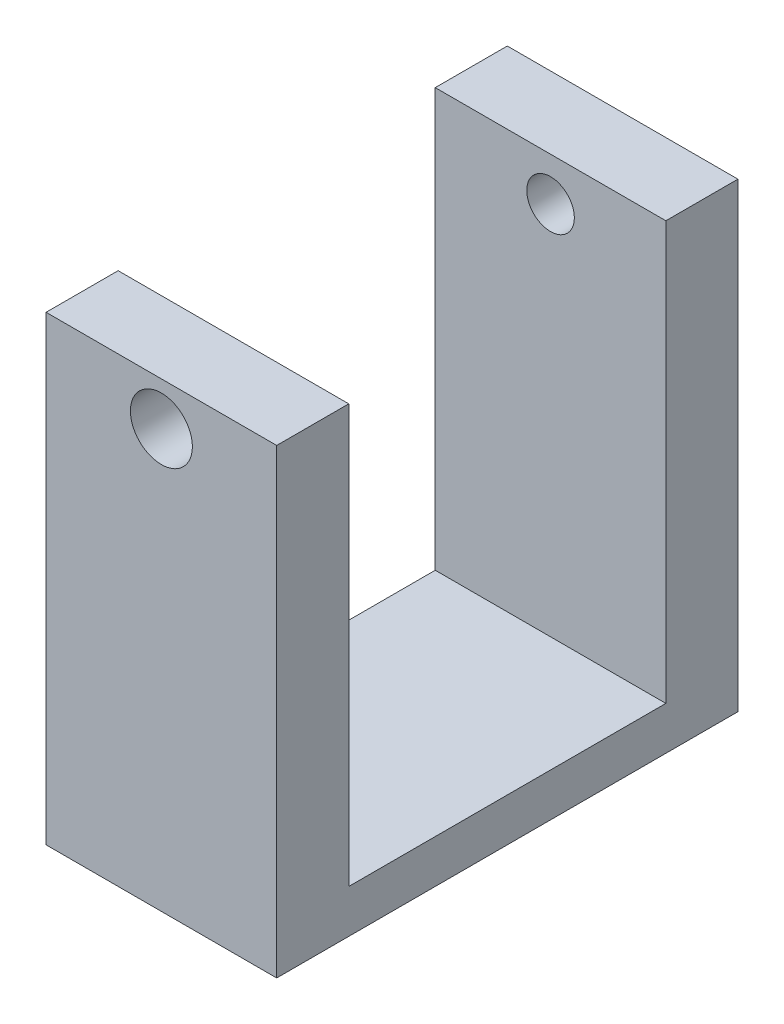
ISO-10303-21;
HEADER;
FILE_DESCRIPTION(('STEP AP214'),'2;1');
FILE_NAME('part.step','',(''),(''),'','','');
FILE_SCHEMA(('AUTOMOTIVE_DESIGN { 1 0 10303 214 1 1 1 1 }'));
ENDSEC;
DATA;
#1=APPLICATION_CONTEXT('core data for automotive mechanical design processes');
#2=APPLICATION_PROTOCOL_DEFINITION('international standard','automotive_design',2000,#1);
#3=PRODUCT_CONTEXT('',#1,'mechanical');
#4=PRODUCT('Part','Part','',(#3));
#5=PRODUCT_RELATED_PRODUCT_CATEGORY('part','',(#4));
#6=PRODUCT_DEFINITION_FORMATION('','',#4);
#7=PRODUCT_DEFINITION_CONTEXT('part definition',#1,'design');
#8=PRODUCT_DEFINITION('design','',#6,#7);
#9=PRODUCT_DEFINITION_SHAPE('','',#8);
#10=(LENGTH_UNIT() NAMED_UNIT(*) SI_UNIT(.MILLI.,.METRE.));
#11=(NAMED_UNIT(*) PLANE_ANGLE_UNIT() SI_UNIT($,.RADIAN.));
#12=(NAMED_UNIT(*) SI_UNIT($,.STERADIAN.) SOLID_ANGLE_UNIT());
#13=UNCERTAINTY_MEASURE_WITH_UNIT(LENGTH_MEASURE(1.E-05),#10,'distance_accuracy_value','');
#14=(GEOMETRIC_REPRESENTATION_CONTEXT(3) GLOBAL_UNCERTAINTY_ASSIGNED_CONTEXT((#13)) GLOBAL_UNIT_ASSIGNED_CONTEXT((#10,
#11,#12)) REPRESENTATION_CONTEXT('',''));
#15=CARTESIAN_POINT('',(0.,0.,0.));
#16=DIRECTION('',(0.,0.,1.));
#17=DIRECTION('',(1.,0.,0.));
#18=AXIS2_PLACEMENT_3D('',#15,#16,#17);
#19=CARTESIAN_POINT('',(8.,32.,16.));
#20=DIRECTION('',(0.,-1.,0.));
#21=DIRECTION('',(0.,0.,-1.));
#22=AXIS2_PLACEMENT_3D('',#19,#20,#21);
#23=PLANE('',#22);
#24=DIRECTION('',(0.,0.,1.));
#25=VECTOR('',#24,1.);
#26=CARTESIAN_POINT('',(-8.,32.,16.));
#27=LINE('',#26,#25);
#28=CARTESIAN_POINT('',(-8.,32.,11.));
#29=VERTEX_POINT('',#28);
#30=CARTESIAN_POINT('',(-8.,32.,16.));
#31=VERTEX_POINT('',#30);
#32=EDGE_CURVE('E219',#29,#31,#27,.T.);
#33=ORIENTED_EDGE('',*,*,#32,.T.);
#34=DIRECTION('',(-1.,0.,0.));
#35=VECTOR('',#34,1.);
#36=CARTESIAN_POINT('',(8.,32.,16.));
#37=LINE('',#36,#35);
#38=CARTESIAN_POINT('',(8.,32.,16.));
#39=VERTEX_POINT('',#38);
#40=EDGE_CURVE('E14',#39,#31,#37,.T.);
#41=ORIENTED_EDGE('',*,*,#40,.F.);
#42=DIRECTION('',(0.,0.,1.));
#43=VECTOR('',#42,1.);
#44=CARTESIAN_POINT('',(8.,32.,16.));
#45=LINE('',#44,#43);
#46=CARTESIAN_POINT('',(8.,32.,11.));
#47=VERTEX_POINT('',#46);
#48=EDGE_CURVE('E240',#47,#39,#45,.T.);
#49=ORIENTED_EDGE('',*,*,#48,.F.);
#50=DIRECTION('',(-1.,0.,0.));
#51=VECTOR('',#50,1.);
#52=CARTESIAN_POINT('',(8.,32.,11.));
#53=LINE('',#52,#51);
#54=EDGE_CURVE('E215',#47,#29,#53,.T.);
#55=ORIENTED_EDGE('',*,*,#54,.T.);
#56=EDGE_LOOP('',(#33,#41,#49,#55));
#57=FACE_BOUND('',#56,.T.);
#58=ADVANCED_FACE('F105',(#57),#23,.F.);
#59=CARTESIAN_POINT('',(8.,32.,16.));
#60=DIRECTION('',(0.,0.,-1.));
#61=DIRECTION('',(0.,1.,0.));
#62=AXIS2_PLACEMENT_3D('',#59,#60,#61);
#63=PLANE('',#62);
#64=CARTESIAN_POINT('',(0.,29.,16.));
#65=DIRECTION('',(0.,0.,1.));
#66=DIRECTION('',(1.,0.,0.));
#67=AXIS2_PLACEMENT_3D('',#64,#65,#66);
#68=CIRCLE('',#67,2.14999999999999);
#69=CARTESIAN_POINT('',(2.14999999999999,29.,16.));
#70=VERTEX_POINT('',#69);
#71=EDGE_CURVE('E283',#70,#70,#68,.T.);
#72=ORIENTED_EDGE('',*,*,#71,.F.);
#73=EDGE_LOOP('',(#72));
#74=FACE_BOUND('',#73,.T.);
#75=DIRECTION('',(0.,-1.,0.));
#76=VECTOR('',#75,1.);
#77=CARTESIAN_POINT('',(-8.,32.,16.));
#78=LINE('',#77,#76);
#79=CARTESIAN_POINT('',(-8.,0.,16.));
#80=VERTEX_POINT('',#79);
#81=EDGE_CURVE('E223',#31,#80,#78,.T.);
#82=ORIENTED_EDGE('',*,*,#81,.T.);
#83=DIRECTION('',(-1.,0.,0.));
#84=VECTOR('',#83,1.);
#85=CARTESIAN_POINT('',(8.,0.,16.));
#86=LINE('',#85,#84);
#87=CARTESIAN_POINT('',(8.,0.,16.));
#88=VERTEX_POINT('',#87);
#89=EDGE_CURVE('E114',#88,#80,#86,.T.);
#90=ORIENTED_EDGE('',*,*,#89,.F.);
#91=DIRECTION('',(0.,-1.,0.));
#92=VECTOR('',#91,1.);
#93=CARTESIAN_POINT('',(8.,32.,16.));
#94=LINE('',#93,#92);
#95=EDGE_CURVE('E174',#39,#88,#94,.T.);
#96=ORIENTED_EDGE('',*,*,#95,.F.);
#97=ORIENTED_EDGE('',*,*,#40,.T.);
#98=EDGE_LOOP('',(#82,#90,#96,#97));
#99=FACE_BOUND('',#98,.T.);
#100=ADVANCED_FACE('F311',(#74,#99),#63,.F.);
#101=CARTESIAN_POINT('',(8.,0.,16.));
#102=DIRECTION('',(0.,1.,0.));
#103=DIRECTION('',(0.,0.,1.));
#104=AXIS2_PLACEMENT_3D('',#101,#102,#103);
#105=PLANE('',#104);
#106=CARTESIAN_POINT('',(0.,0.,-13.5));
#107=DIRECTION('',(0.,-1.,0.));
#108=DIRECTION('',(0.,0.,-1.));
#109=AXIS2_PLACEMENT_3D('',#106,#107,#108);
#110=CIRCLE('',#109,1.25);
#111=CARTESIAN_POINT('',(0.,0.,-14.75));
#112=VERTEX_POINT('',#111);
#113=EDGE_CURVE('E303',#112,#112,#110,.T.);
#114=ORIENTED_EDGE('',*,*,#113,.F.);
#115=EDGE_LOOP('',(#114));
#116=FACE_BOUND('',#115,.T.);
#117=CARTESIAN_POINT('',(0.,0.,13.5));
#118=DIRECTION('',(0.,-1.,0.));
#119=DIRECTION('',(0.,0.,-1.));
#120=AXIS2_PLACEMENT_3D('',#117,#118,#119);
#121=CIRCLE('',#120,1.25);
#122=CARTESIAN_POINT('',(0.,0.,12.25));
#123=VERTEX_POINT('',#122);
#124=EDGE_CURVE('E297',#123,#123,#121,.T.);
#125=ORIENTED_EDGE('',*,*,#124,.F.);
#126=EDGE_LOOP('',(#125));
#127=FACE_BOUND('',#126,.T.);
#128=DIRECTION('',(0.,0.,-1.));
#129=VECTOR('',#128,1.);
#130=CARTESIAN_POINT('',(-8.,0.,16.));
#131=LINE('',#130,#129);
#132=CARTESIAN_POINT('',(-8.,0.,-16.));
#133=VERTEX_POINT('',#132);
#134=EDGE_CURVE('E227',#80,#133,#131,.T.);
#135=ORIENTED_EDGE('',*,*,#134,.T.);
#136=DIRECTION('',(-1.,0.,0.));
#137=VECTOR('',#136,1.);
#138=CARTESIAN_POINT('',(8.,0.,-16.));
#139=LINE('',#138,#137);
#140=CARTESIAN_POINT('',(8.,0.,-16.));
#141=VERTEX_POINT('',#140);
#142=EDGE_CURVE('E249',#141,#133,#139,.T.);
#143=ORIENTED_EDGE('',*,*,#142,.F.);
#144=DIRECTION('',(0.,0.,-1.));
#145=VECTOR('',#144,1.);
#146=CARTESIAN_POINT('',(8.,0.,16.));
#147=LINE('',#146,#145);
#148=EDGE_CURVE('E260',#88,#141,#147,.T.);
#149=ORIENTED_EDGE('',*,*,#148,.F.);
#150=ORIENTED_EDGE('',*,*,#89,.T.);
#151=EDGE_LOOP('',(#135,#143,#149,#150));
#152=FACE_BOUND('',#151,.T.);
#153=ADVANCED_FACE('F258',(#116,#127,#152),#105,.F.);
#154=CARTESIAN_POINT('',(8.,32.,-16.));
#155=DIRECTION('',(0.,0.,1.));
#156=DIRECTION('',(0.,-1.,0.));
#157=AXIS2_PLACEMENT_3D('',#154,#155,#156);
#158=PLANE('',#157);
#159=CARTESIAN_POINT('',(0.,29.,-16.));
#160=DIRECTION('',(0.,0.,-1.));
#161=DIRECTION('',(0.,1.,0.));
#162=AXIS2_PLACEMENT_3D('',#159,#160,#161);
#163=CIRCLE('',#162,1.64999999999999);
#164=CARTESIAN_POINT('',(0.,30.65,-16.));
#165=VERTEX_POINT('',#164);
#166=EDGE_CURVE('E291',#165,#165,#163,.T.);
#167=ORIENTED_EDGE('',*,*,#166,.F.);
#168=EDGE_LOOP('',(#167));
#169=FACE_BOUND('',#168,.T.);
#170=DIRECTION('',(0.,1.,0.));
#171=VECTOR('',#170,1.);
#172=CARTESIAN_POINT('',(-8.,32.,-16.));
#173=LINE('',#172,#171);
#174=CARTESIAN_POINT('',(-8.,32.,-16.));
#175=VERTEX_POINT('',#174);
#176=EDGE_CURVE('E229',#133,#175,#173,.T.);
#177=ORIENTED_EDGE('',*,*,#176,.T.);
#178=DIRECTION('',(-1.,0.,0.));
#179=VECTOR('',#178,1.);
#180=CARTESIAN_POINT('',(8.,32.,-16.));
#181=LINE('',#180,#179);
#182=CARTESIAN_POINT('',(8.,32.,-16.));
#183=VERTEX_POINT('',#182);
#184=EDGE_CURVE('E246',#183,#175,#181,.T.);
#185=ORIENTED_EDGE('',*,*,#184,.F.);
#186=DIRECTION('',(0.,1.,0.));
#187=VECTOR('',#186,1.);
#188=CARTESIAN_POINT('',(8.,32.,-16.));
#189=LINE('',#188,#187);
#190=EDGE_CURVE('E272',#141,#183,#189,.T.);
#191=ORIENTED_EDGE('',*,*,#190,.F.);
#192=ORIENTED_EDGE('',*,*,#142,.T.);
#193=EDGE_LOOP('',(#177,#185,#191,#192));
#194=FACE_BOUND('',#193,.T.);
#195=ADVANCED_FACE('F268',(#169,#194),#158,.F.);
#196=CARTESIAN_POINT('',(8.,32.,-11.));
#197=DIRECTION('',(0.,-1.,0.));
#198=DIRECTION('',(0.,0.,-1.));
#199=AXIS2_PLACEMENT_3D('',#196,#197,#198);
#200=PLANE('',#199);
#201=DIRECTION('',(0.,0.,1.));
#202=VECTOR('',#201,1.);
#203=CARTESIAN_POINT('',(-8.,32.,-11.));
#204=LINE('',#203,#202);
#205=CARTESIAN_POINT('',(-8.,32.,-11.));
#206=VERTEX_POINT('',#205);
#207=EDGE_CURVE('E232',#175,#206,#204,.T.);
#208=ORIENTED_EDGE('',*,*,#207,.T.);
#209=DIRECTION('',(-1.,0.,0.));
#210=VECTOR('',#209,1.);
#211=CARTESIAN_POINT('',(8.,32.,-11.));
#212=LINE('',#211,#210);
#213=CARTESIAN_POINT('',(8.,32.,-11.));
#214=VERTEX_POINT('',#213);
#215=EDGE_CURVE('E206',#214,#206,#212,.T.);
#216=ORIENTED_EDGE('',*,*,#215,.F.);
#217=DIRECTION('',(0.,0.,1.));
#218=VECTOR('',#217,1.);
#219=CARTESIAN_POINT('',(8.,32.,-11.));
#220=LINE('',#219,#218);
#221=EDGE_CURVE('E196',#183,#214,#220,.T.);
#222=ORIENTED_EDGE('',*,*,#221,.F.);
#223=ORIENTED_EDGE('',*,*,#184,.T.);
#224=EDGE_LOOP('',(#208,#216,#222,#223));
#225=FACE_BOUND('',#224,.T.);
#226=ADVANCED_FACE('F271',(#225),#200,.F.);
#227=CARTESIAN_POINT('',(8.,32.,-11.));
#228=DIRECTION('',(0.,0.,-1.));
#229=DIRECTION('',(0.,1.,0.));
#230=AXIS2_PLACEMENT_3D('',#227,#228,#229);
#231=PLANE('',#230);
#232=CARTESIAN_POINT('',(0.,29.,-11.));
#233=DIRECTION('',(0.,0.,-1.));
#234=DIRECTION('',(0.,1.,0.));
#235=AXIS2_PLACEMENT_3D('',#232,#233,#234);
#236=CIRCLE('',#235,1.64999999999999);
#237=CARTESIAN_POINT('',(0.,30.65,-11.));
#238=VERTEX_POINT('',#237);
#239=EDGE_CURVE('E287',#238,#238,#236,.T.);
#240=ORIENTED_EDGE('',*,*,#239,.T.);
#241=EDGE_LOOP('',(#240));
#242=FACE_BOUND('',#241,.T.);
#243=DIRECTION('',(0.,-1.,0.));
#244=VECTOR('',#243,1.);
#245=CARTESIAN_POINT('',(-8.,32.,-11.));
#246=LINE('',#245,#244);
#247=CARTESIAN_POINT('',(-8.,3.,-11.));
#248=VERTEX_POINT('',#247);
#249=EDGE_CURVE('E205',#206,#248,#246,.T.);
#250=ORIENTED_EDGE('',*,*,#249,.T.);
#251=DIRECTION('',(-1.,0.,0.));
#252=VECTOR('',#251,1.);
#253=CARTESIAN_POINT('',(8.,3.,-11.));
#254=LINE('',#253,#252);
#255=CARTESIAN_POINT('',(8.,3.,-11.));
#256=VERTEX_POINT('',#255);
#257=EDGE_CURVE('E202',#256,#248,#254,.T.);
#258=ORIENTED_EDGE('',*,*,#257,.F.);
#259=DIRECTION('',(0.,-1.,0.));
#260=VECTOR('',#259,1.);
#261=CARTESIAN_POINT('',(8.,32.,-11.));
#262=LINE('',#261,#260);
#263=EDGE_CURVE('E190',#214,#256,#262,.T.);
#264=ORIENTED_EDGE('',*,*,#263,.F.);
#265=ORIENTED_EDGE('',*,*,#215,.T.);
#266=EDGE_LOOP('',(#250,#258,#264,#265));
#267=FACE_BOUND('',#266,.T.);
#268=ADVANCED_FACE('F203',(#242,#267),#231,.F.);
#269=CARTESIAN_POINT('',(8.,3.,11.));
#270=DIRECTION('',(0.,-1.,0.));
#271=DIRECTION('',(0.,0.,-1.));
#272=AXIS2_PLACEMENT_3D('',#269,#270,#271);
#273=PLANE('',#272);
#274=DIRECTION('',(0.,0.,1.));
#275=VECTOR('',#274,1.);
#276=CARTESIAN_POINT('',(-8.,3.,11.));
#277=LINE('',#276,#275);
#278=CARTESIAN_POINT('',(-8.,3.,11.));
#279=VERTEX_POINT('',#278);
#280=EDGE_CURVE('E159',#248,#279,#277,.T.);
#281=ORIENTED_EDGE('',*,*,#280,.T.);
#282=DIRECTION('',(-1.,0.,0.));
#283=VECTOR('',#282,1.);
#284=CARTESIAN_POINT('',(8.,3.,11.));
#285=LINE('',#284,#283);
#286=CARTESIAN_POINT('',(8.,3.,11.));
#287=VERTEX_POINT('',#286);
#288=EDGE_CURVE('E207',#287,#279,#285,.T.);
#289=ORIENTED_EDGE('',*,*,#288,.F.);
#290=DIRECTION('',(0.,0.,1.));
#291=VECTOR('',#290,1.);
#292=CARTESIAN_POINT('',(8.,3.,11.));
#293=LINE('',#292,#291);
#294=EDGE_CURVE('E194',#256,#287,#293,.T.);
#295=ORIENTED_EDGE('',*,*,#294,.F.);
#296=ORIENTED_EDGE('',*,*,#257,.T.);
#297=EDGE_LOOP('',(#281,#289,#295,#296));
#298=FACE_BOUND('',#297,.T.);
#299=ADVANCED_FACE('F209',(#298),#273,.F.);
#300=CARTESIAN_POINT('',(8.,32.,11.));
#301=DIRECTION('',(0.,0.,1.));
#302=DIRECTION('',(0.,-1.,0.));
#303=AXIS2_PLACEMENT_3D('',#300,#301,#302);
#304=PLANE('',#303);
#305=CARTESIAN_POINT('',(0.,29.,11.));
#306=DIRECTION('',(0.,0.,1.));
#307=DIRECTION('',(0.,-1.,0.));
#308=AXIS2_PLACEMENT_3D('',#305,#306,#307);
#309=CIRCLE('',#308,2.14999999999999);
#310=CARTESIAN_POINT('',(0.,26.85,11.));
#311=VERTEX_POINT('',#310);
#312=EDGE_CURVE('E224',#311,#311,#309,.T.);
#313=ORIENTED_EDGE('',*,*,#312,.T.);
#314=EDGE_LOOP('',(#313));
#315=FACE_BOUND('',#314,.T.);
#316=DIRECTION('',(0.,1.,0.));
#317=VECTOR('',#316,1.);
#318=CARTESIAN_POINT('',(-8.,32.,11.));
#319=LINE('',#318,#317);
#320=EDGE_CURVE('E166',#279,#29,#319,.T.);
#321=ORIENTED_EDGE('',*,*,#320,.T.);
#322=ORIENTED_EDGE('',*,*,#54,.F.);
#323=DIRECTION('',(0.,1.,0.));
#324=VECTOR('',#323,1.);
#325=CARTESIAN_POINT('',(8.,32.,11.));
#326=LINE('',#325,#324);
#327=EDGE_CURVE('E125',#287,#47,#326,.T.);
#328=ORIENTED_EDGE('',*,*,#327,.F.);
#329=ORIENTED_EDGE('',*,*,#288,.T.);
#330=EDGE_LOOP('',(#321,#322,#328,#329));
#331=FACE_BOUND('',#330,.T.);
#332=ADVANCED_FACE('F339',(#315,#331),#304,.F.);
#333=CARTESIAN_POINT('',(8.,0.,0.));
#334=DIRECTION('',(-1.,0.,0.));
#335=DIRECTION('',(0.,0.,1.));
#336=AXIS2_PLACEMENT_3D('',#333,#334,#335);
#337=PLANE('',#336);
#338=ORIENTED_EDGE('',*,*,#48,.T.);
#339=ORIENTED_EDGE('',*,*,#95,.T.);
#340=ORIENTED_EDGE('',*,*,#148,.T.);
#341=ORIENTED_EDGE('',*,*,#190,.T.);
#342=ORIENTED_EDGE('',*,*,#221,.T.);
#343=ORIENTED_EDGE('',*,*,#263,.T.);
#344=ORIENTED_EDGE('',*,*,#294,.T.);
#345=ORIENTED_EDGE('',*,*,#327,.T.);
#346=EDGE_LOOP('',(#338,#339,#340,#341,#342,#343,#344,#345));
#347=FACE_BOUND('',#346,.T.);
#348=ADVANCED_FACE('F192',(#347),#337,.F.);
#349=CARTESIAN_POINT('',(-8.,0.,0.));
#350=DIRECTION('',(-1.,0.,0.));
#351=DIRECTION('',(0.,0.,1.));
#352=AXIS2_PLACEMENT_3D('',#349,#350,#351);
#353=PLANE('',#352);
#354=ORIENTED_EDGE('',*,*,#32,.F.);
#355=ORIENTED_EDGE('',*,*,#320,.F.);
#356=ORIENTED_EDGE('',*,*,#280,.F.);
#357=ORIENTED_EDGE('',*,*,#249,.F.);
#358=ORIENTED_EDGE('',*,*,#207,.F.);
#359=ORIENTED_EDGE('',*,*,#176,.F.);
#360=ORIENTED_EDGE('',*,*,#134,.F.);
#361=ORIENTED_EDGE('',*,*,#81,.F.);
#362=EDGE_LOOP('',(#354,#355,#356,#357,#358,#359,#360,#361));
#363=FACE_BOUND('',#362,.T.);
#364=ADVANCED_FACE('F264',(#363),#353,.T.);
#365=CARTESIAN_POINT('',(0.,29.,16.));
#366=DIRECTION('',(0.,0.,1.));
#367=DIRECTION('',(1.,0.,0.));
#368=AXIS2_PLACEMENT_3D('',#365,#366,#367);
#369=CYLINDRICAL_SURFACE('',#368,2.14999999999999);
#370=ORIENTED_EDGE('',*,*,#312,.F.);
#371=EDGE_LOOP('',(#370));
#372=FACE_BOUND('',#371,.T.);
#373=ORIENTED_EDGE('',*,*,#71,.T.);
#374=EDGE_LOOP('',(#373));
#375=FACE_BOUND('',#374,.T.);
#376=ADVANCED_FACE('F363',(#372,#375),#369,.F.);
#377=CARTESIAN_POINT('',(0.,29.,-16.));
#378=DIRECTION('',(0.,0.,-1.));
#379=DIRECTION('',(0.,1.,0.));
#380=AXIS2_PLACEMENT_3D('',#377,#378,#379);
#381=CYLINDRICAL_SURFACE('',#380,1.64999999999999);
#382=ORIENTED_EDGE('',*,*,#239,.F.);
#383=EDGE_LOOP('',(#382));
#384=FACE_BOUND('',#383,.T.);
#385=ORIENTED_EDGE('',*,*,#166,.T.);
#386=EDGE_LOOP('',(#385));
#387=FACE_BOUND('',#386,.T.);
#388=ADVANCED_FACE('F327',(#384,#387),#381,.F.);
#389=CARTESIAN_POINT('',(0.,8.5,13.5));
#390=DIRECTION('',(0.,-1.,0.));
#391=DIRECTION('',(0.,0.,-1.));
#392=AXIS2_PLACEMENT_3D('',#389,#390,#391);
#393=CONICAL_SURFACE('',#392,1.25,1.02974425867665);
#394=CARTESIAN_POINT('',(0.,9.25107577378445,13.5));
#395=VERTEX_POINT('',#394);
#396=VERTEX_LOOP('',#395);
#397=FACE_BOUND('',#396,.T.);
#398=CARTESIAN_POINT('',(0.,8.5,13.5));
#399=DIRECTION('',(0.,-1.,0.));
#400=DIRECTION('',(0.,0.,-1.));
#401=AXIS2_PLACEMENT_3D('',#398,#399,#400);
#402=CIRCLE('',#401,1.25);
#403=CARTESIAN_POINT('',(0.,8.5,12.25));
#404=VERTEX_POINT('',#403);
#405=EDGE_CURVE('E294',#404,#404,#402,.T.);
#406=ORIENTED_EDGE('',*,*,#405,.T.);
#407=EDGE_LOOP('',(#406));
#408=FACE_BOUND('',#407,.T.);
#409=ADVANCED_FACE('F318',(#397,#408),#393,.F.);
#410=CARTESIAN_POINT('',(0.,0.,13.5));
#411=DIRECTION('',(0.,-1.,0.));
#412=DIRECTION('',(0.,0.,-1.));
#413=AXIS2_PLACEMENT_3D('',#410,#411,#412);
#414=CYLINDRICAL_SURFACE('',#413,1.25);
#415=ORIENTED_EDGE('',*,*,#405,.F.);
#416=EDGE_LOOP('',(#415));
#417=FACE_BOUND('',#416,.T.);
#418=ORIENTED_EDGE('',*,*,#124,.T.);
#419=EDGE_LOOP('',(#418));
#420=FACE_BOUND('',#419,.T.);
#421=ADVANCED_FACE('F315',(#417,#420),#414,.F.);
#422=CARTESIAN_POINT('',(0.,8.5,-13.5));
#423=DIRECTION('',(0.,-1.,0.));
#424=DIRECTION('',(0.,0.,-1.));
#425=AXIS2_PLACEMENT_3D('',#422,#423,#424);
#426=CONICAL_SURFACE('',#425,1.25,1.02974425867665);
#427=CARTESIAN_POINT('',(0.,9.25107577378445,-13.5));
#428=VERTEX_POINT('',#427);
#429=VERTEX_LOOP('',#428);
#430=FACE_BOUND('',#429,.T.);
#431=CARTESIAN_POINT('',(0.,8.5,-13.5));
#432=DIRECTION('',(0.,-1.,0.));
#433=DIRECTION('',(0.,0.,-1.));
#434=AXIS2_PLACEMENT_3D('',#431,#432,#433);
#435=CIRCLE('',#434,1.25);
#436=CARTESIAN_POINT('',(0.,8.5,-14.75));
#437=VERTEX_POINT('',#436);
#438=EDGE_CURVE('E300',#437,#437,#435,.T.);
#439=ORIENTED_EDGE('',*,*,#438,.T.);
#440=EDGE_LOOP('',(#439));
#441=FACE_BOUND('',#440,.T.);
#442=ADVANCED_FACE('F317',(#430,#441),#426,.F.);
#443=CARTESIAN_POINT('',(0.,0.,-13.5));
#444=DIRECTION('',(0.,-1.,0.));
#445=DIRECTION('',(0.,0.,-1.));
#446=AXIS2_PLACEMENT_3D('',#443,#444,#445);
#447=CYLINDRICAL_SURFACE('',#446,1.25);
#448=ORIENTED_EDGE('',*,*,#438,.F.);
#449=EDGE_LOOP('',(#448));
#450=FACE_BOUND('',#449,.T.);
#451=ORIENTED_EDGE('',*,*,#113,.T.);
#452=EDGE_LOOP('',(#451));
#453=FACE_BOUND('',#452,.T.);
#454=ADVANCED_FACE('F307',(#450,#453),#447,.F.);
#455=CLOSED_SHELL('',(#58,#100,#153,#195,#226,#268,#299,#332,#348,#364,#376,#388,#409,#421,#442,#454));
#456=MANIFOLD_SOLID_BREP('B2',#455);
#457=ADVANCED_BREP_SHAPE_REPRESENTATION('',(#18,#456),#14);
#458=SHAPE_DEFINITION_REPRESENTATION(#9,#457);
ENDSEC;
END-ISO-10303-21;
